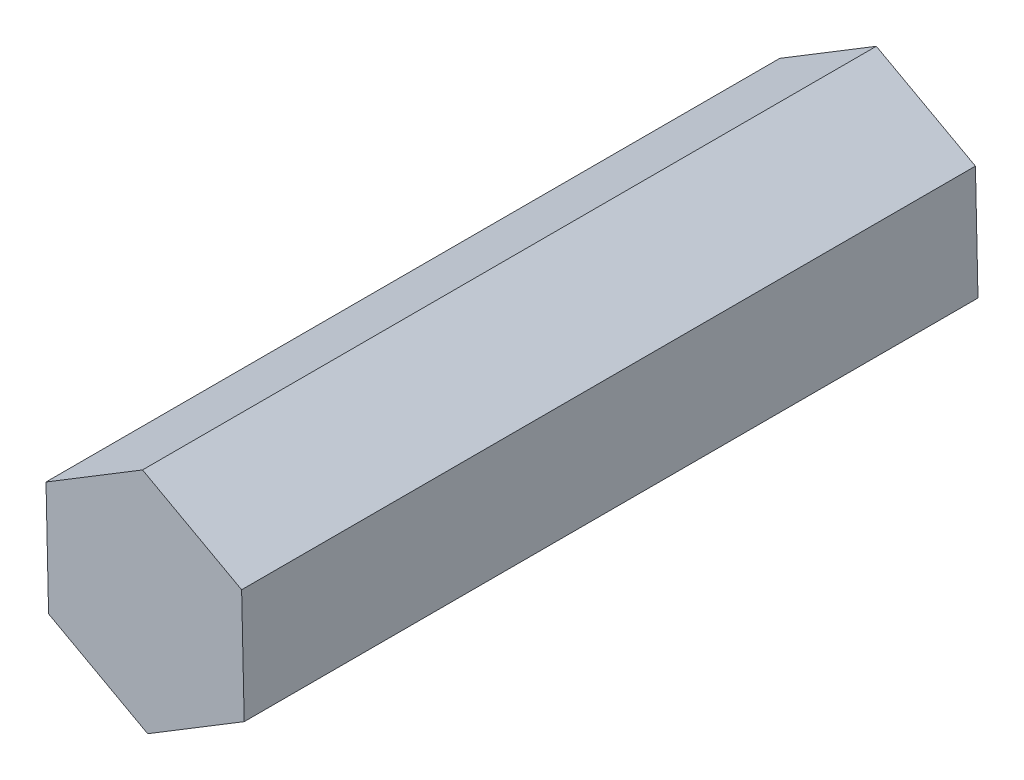
ISO-10303-21;
HEADER;
FILE_DESCRIPTION(('STEP AP214'),'2;1');
FILE_NAME('part.step','',(''),(''),'','','');
FILE_SCHEMA(('AUTOMOTIVE_DESIGN { 1 0 10303 214 1 1 1 1 }'));
ENDSEC;
DATA;
#1=APPLICATION_CONTEXT('core data for automotive mechanical design processes');
#2=APPLICATION_PROTOCOL_DEFINITION('international standard','automotive_design',2000,#1);
#3=PRODUCT_CONTEXT('',#1,'mechanical');
#4=PRODUCT('Part','Part','',(#3));
#5=PRODUCT_RELATED_PRODUCT_CATEGORY('part','',(#4));
#6=PRODUCT_DEFINITION_FORMATION('','',#4);
#7=PRODUCT_DEFINITION_CONTEXT('part definition',#1,'design');
#8=PRODUCT_DEFINITION('design','',#6,#7);
#9=PRODUCT_DEFINITION_SHAPE('','',#8);
#10=(LENGTH_UNIT() NAMED_UNIT(*) SI_UNIT(.MILLI.,.METRE.));
#11=(NAMED_UNIT(*) PLANE_ANGLE_UNIT() SI_UNIT($,.RADIAN.));
#12=(NAMED_UNIT(*) SI_UNIT($,.STERADIAN.) SOLID_ANGLE_UNIT());
#13=UNCERTAINTY_MEASURE_WITH_UNIT(LENGTH_MEASURE(1.E-05),#10,'distance_accuracy_value','');
#14=(GEOMETRIC_REPRESENTATION_CONTEXT(3) GLOBAL_UNCERTAINTY_ASSIGNED_CONTEXT((#13)) GLOBAL_UNIT_ASSIGNED_CONTEXT((#10,
#11,#12)) REPRESENTATION_CONTEXT('',''));
#15=CARTESIAN_POINT('',(0.,0.,0.));
#16=DIRECTION('',(0.,0.,1.));
#17=DIRECTION('',(1.,0.,0.));
#18=AXIS2_PLACEMENT_3D('',#15,#16,#17);
#19=CARTESIAN_POINT('',(-0.167704669362522,7.33043030641499,47.625));
#20=DIRECTION('',(0.519676840163033,-0.854362909891438,0.));
#21=DIRECTION('',(0.854362909891438,0.519676840163033,0.));
#22=AXIS2_PLACEMENT_3D('',#19,#20,#21);
#23=PLANE('',#22);
#24=DIRECTION('',(-0.854362909891438,-0.519676840163033,0.));
#25=VECTOR('',#24,1.);
#26=CARTESIAN_POINT('',(-0.167704669362522,7.33043030641499,0.));
#27=LINE('',#26,#25);
#28=CARTESIAN_POINT('',(-0.167704669362522,7.33043030641499,0.));
#29=VERTEX_POINT('',#28);
#30=CARTESIAN_POINT('',(-6.43219120070799,3.51997864920628,0.));
#31=VERTEX_POINT('',#30);
#32=EDGE_CURVE('E117',#29,#31,#27,.T.);
#33=ORIENTED_EDGE('',*,*,#32,.T.);
#34=DIRECTION('',(0.,0.,-1.));
#35=VECTOR('',#34,1.);
#36=CARTESIAN_POINT('',(-6.43219120070799,3.51997864920628,47.625));
#37=LINE('',#36,#35);
#38=CARTESIAN_POINT('',(-6.43219120070799,3.51997864920628,47.625));
#39=VERTEX_POINT('',#38);
#40=EDGE_CURVE('E11',#39,#31,#37,.T.);
#41=ORIENTED_EDGE('',*,*,#40,.F.);
#42=DIRECTION('',(-0.854362909891438,-0.519676840163033,0.));
#43=VECTOR('',#42,1.);
#44=CARTESIAN_POINT('',(-0.167704669362522,7.33043030641499,47.625));
#45=LINE('',#44,#43);
#46=CARTESIAN_POINT('',(-0.167704669362522,7.33043030641499,47.625));
#47=VERTEX_POINT('',#46);
#48=EDGE_CURVE('E127',#47,#39,#45,.T.);
#49=ORIENTED_EDGE('',*,*,#48,.F.);
#50=DIRECTION('',(0.,0.,-1.));
#51=VECTOR('',#50,1.);
#52=CARTESIAN_POINT('',(-0.167704669362522,7.33043030641499,47.625));
#53=LINE('',#52,#51);
#54=EDGE_CURVE('E113',#47,#29,#53,.T.);
#55=ORIENTED_EDGE('',*,*,#54,.T.);
#56=EDGE_LOOP('',(#33,#41,#49,#55));
#57=FACE_BOUND('',#56,.T.);
#58=ADVANCED_FACE('F33',(#57),#23,.F.);
#59=CARTESIAN_POINT('',(-6.43219120070799,3.51997864920628,47.625));
#60=DIRECTION('',(0.999738404098697,0.0228718903938927,0.));
#61=DIRECTION('',(-0.0228718903938927,0.999738404098697,0.));
#62=AXIS2_PLACEMENT_3D('',#59,#60,#61);
#63=PLANE('',#62);
#64=DIRECTION('',(0.0228718903938927,-0.999738404098697,0.));
#65=VECTOR('',#64,1.);
#66=CARTESIAN_POINT('',(-6.43219120070799,3.51997864920628,0.));
#67=LINE('',#66,#65);
#68=CARTESIAN_POINT('',(-6.26448653134546,-3.81045165720871,0.));
#69=VERTEX_POINT('',#68);
#70=EDGE_CURVE('E120',#31,#69,#67,.T.);
#71=ORIENTED_EDGE('',*,*,#70,.T.);
#72=DIRECTION('',(0.,0.,-1.));
#73=VECTOR('',#72,1.);
#74=CARTESIAN_POINT('',(-6.26448653134546,-3.81045165720871,47.625));
#75=LINE('',#74,#73);
#76=CARTESIAN_POINT('',(-6.26448653134546,-3.81045165720871,47.625));
#77=VERTEX_POINT('',#76);
#78=EDGE_CURVE('E41',#77,#69,#75,.T.);
#79=ORIENTED_EDGE('',*,*,#78,.F.);
#80=DIRECTION('',(0.0228718903938927,-0.999738404098697,0.));
#81=VECTOR('',#80,1.);
#82=CARTESIAN_POINT('',(-6.43219120070799,3.51997864920628,47.625));
#83=LINE('',#82,#81);
#84=EDGE_CURVE('E86',#39,#77,#83,.T.);
#85=ORIENTED_EDGE('',*,*,#84,.F.);
#86=ORIENTED_EDGE('',*,*,#40,.T.);
#87=EDGE_LOOP('',(#71,#79,#85,#86));
#88=FACE_BOUND('',#87,.T.);
#89=ADVANCED_FACE('F151',(#88),#63,.F.);
#90=CARTESIAN_POINT('',(-6.26448653134546,-3.81045165720871,47.625));
#91=DIRECTION('',(0.480061563935664,0.877234800285331,0.));
#92=DIRECTION('',(-0.877234800285331,0.480061563935664,0.));
#93=AXIS2_PLACEMENT_3D('',#90,#91,#92);
#94=PLANE('',#93);
#95=DIRECTION('',(0.877234800285331,-0.480061563935664,0.));
#96=VECTOR('',#95,1.);
#97=CARTESIAN_POINT('',(-6.26448653134546,-3.81045165720871,0.));
#98=LINE('',#97,#96);
#99=CARTESIAN_POINT('',(0.167704669362527,-7.33043030641499,0.));
#100=VERTEX_POINT('',#99);
#101=EDGE_CURVE('E122',#69,#100,#98,.T.);
#102=ORIENTED_EDGE('',*,*,#101,.T.);
#103=DIRECTION('',(0.,0.,-1.));
#104=VECTOR('',#103,1.);
#105=CARTESIAN_POINT('',(0.167704669362527,-7.33043030641499,47.625));
#106=LINE('',#105,#104);
#107=CARTESIAN_POINT('',(0.167704669362527,-7.33043030641499,47.625));
#108=VERTEX_POINT('',#107);
#109=EDGE_CURVE('E108',#108,#100,#106,.T.);
#110=ORIENTED_EDGE('',*,*,#109,.F.);
#111=DIRECTION('',(0.877234800285331,-0.480061563935664,0.));
#112=VECTOR('',#111,1.);
#113=CARTESIAN_POINT('',(-6.26448653134546,-3.81045165720871,47.625));
#114=LINE('',#113,#112);
#115=EDGE_CURVE('E99',#77,#108,#114,.T.);
#116=ORIENTED_EDGE('',*,*,#115,.F.);
#117=ORIENTED_EDGE('',*,*,#78,.T.);
#118=EDGE_LOOP('',(#102,#110,#116,#117));
#119=FACE_BOUND('',#118,.T.);
#120=ADVANCED_FACE('F133',(#119),#94,.F.);
#121=CARTESIAN_POINT('',(0.167704669362527,-7.33043030641499,47.625));
#122=DIRECTION('',(-0.519676840163033,0.854362909891438,0.));
#123=DIRECTION('',(-0.854362909891438,-0.519676840163033,0.));
#124=AXIS2_PLACEMENT_3D('',#121,#122,#123);
#125=PLANE('',#124);
#126=DIRECTION('',(0.854362909891438,0.519676840163033,0.));
#127=VECTOR('',#126,1.);
#128=CARTESIAN_POINT('',(0.167704669362527,-7.33043030641499,0.));
#129=LINE('',#128,#127);
#130=CARTESIAN_POINT('',(6.43219120070799,-3.51997864920628,0.));
#131=VERTEX_POINT('',#130);
#132=EDGE_CURVE('E107',#100,#131,#129,.T.);
#133=ORIENTED_EDGE('',*,*,#132,.T.);
#134=DIRECTION('',(0.,0.,-1.));
#135=VECTOR('',#134,1.);
#136=CARTESIAN_POINT('',(6.43219120070799,-3.51997864920628,47.625));
#137=LINE('',#136,#135);
#138=CARTESIAN_POINT('',(6.43219120070799,-3.51997864920628,47.625));
#139=VERTEX_POINT('',#138);
#140=EDGE_CURVE('E104',#139,#131,#137,.T.);
#141=ORIENTED_EDGE('',*,*,#140,.F.);
#142=DIRECTION('',(0.854362909891438,0.519676840163033,0.));
#143=VECTOR('',#142,1.);
#144=CARTESIAN_POINT('',(0.167704669362527,-7.33043030641499,47.625));
#145=LINE('',#144,#143);
#146=EDGE_CURVE('E93',#108,#139,#145,.T.);
#147=ORIENTED_EDGE('',*,*,#146,.F.);
#148=ORIENTED_EDGE('',*,*,#109,.T.);
#149=EDGE_LOOP('',(#133,#141,#147,#148));
#150=FACE_BOUND('',#149,.T.);
#151=ADVANCED_FACE('F105',(#150),#125,.F.);
#152=CARTESIAN_POINT('',(6.43219120070799,-3.51997864920628,47.625));
#153=DIRECTION('',(-0.999738404098697,-0.0228718903938919,0.));
#154=DIRECTION('',(0.0228718903938919,-0.999738404098697,0.));
#155=AXIS2_PLACEMENT_3D('',#152,#153,#154);
#156=PLANE('',#155);
#157=DIRECTION('',(-0.0228718903938919,0.999738404098697,0.));
#158=VECTOR('',#157,1.);
#159=CARTESIAN_POINT('',(6.43219120070799,-3.51997864920628,0.));
#160=LINE('',#159,#158);
#161=CARTESIAN_POINT('',(6.26448653134546,3.81045165720871,0.));
#162=VERTEX_POINT('',#161);
#163=EDGE_CURVE('E72',#131,#162,#160,.T.);
#164=ORIENTED_EDGE('',*,*,#163,.T.);
#165=DIRECTION('',(0.,0.,-1.));
#166=VECTOR('',#165,1.);
#167=CARTESIAN_POINT('',(6.26448653134546,3.81045165720871,47.625));
#168=LINE('',#167,#166);
#169=CARTESIAN_POINT('',(6.26448653134546,3.81045165720871,47.625));
#170=VERTEX_POINT('',#169);
#171=EDGE_CURVE('E109',#170,#162,#168,.T.);
#172=ORIENTED_EDGE('',*,*,#171,.F.);
#173=DIRECTION('',(-0.0228718903938919,0.999738404098697,0.));
#174=VECTOR('',#173,1.);
#175=CARTESIAN_POINT('',(6.43219120070799,-3.51997864920628,47.625));
#176=LINE('',#175,#174);
#177=EDGE_CURVE('E97',#139,#170,#176,.T.);
#178=ORIENTED_EDGE('',*,*,#177,.F.);
#179=ORIENTED_EDGE('',*,*,#140,.T.);
#180=EDGE_LOOP('',(#164,#172,#178,#179));
#181=FACE_BOUND('',#180,.T.);
#182=ADVANCED_FACE('F111',(#181),#156,.F.);
#183=CARTESIAN_POINT('',(6.26448653134546,3.81045165720871,47.625));
#184=DIRECTION('',(-0.480061563935665,-0.87723480028533,0.));
#185=DIRECTION('',(0.87723480028533,-0.480061563935665,0.));
#186=AXIS2_PLACEMENT_3D('',#183,#184,#185);
#187=PLANE('',#186);
#188=DIRECTION('',(-0.877234800285331,0.480061563935665,0.));
#189=VECTOR('',#188,1.);
#190=CARTESIAN_POINT('',(6.26448653134546,3.81045165720871,0.));
#191=LINE('',#190,#189);
#192=EDGE_CURVE('E78',#162,#29,#191,.T.);
#193=ORIENTED_EDGE('',*,*,#192,.T.);
#194=ORIENTED_EDGE('',*,*,#54,.F.);
#195=DIRECTION('',(-0.877234800285331,0.480061563935665,0.));
#196=VECTOR('',#195,1.);
#197=CARTESIAN_POINT('',(6.26448653134546,3.81045165720871,47.625));
#198=LINE('',#197,#196);
#199=EDGE_CURVE('E49',#170,#47,#198,.T.);
#200=ORIENTED_EDGE('',*,*,#199,.F.);
#201=ORIENTED_EDGE('',*,*,#171,.T.);
#202=EDGE_LOOP('',(#193,#194,#200,#201));
#203=FACE_BOUND('',#202,.T.);
#204=ADVANCED_FACE('F140',(#203),#187,.F.);
#205=CARTESIAN_POINT('',(0.,0.,47.625));
#206=DIRECTION('',(0.,0.,1.));
#207=DIRECTION('',(1.,0.,0.));
#208=AXIS2_PLACEMENT_3D('',#205,#206,#207);
#209=PLANE('',#208);
#210=ORIENTED_EDGE('',*,*,#48,.T.);
#211=ORIENTED_EDGE('',*,*,#84,.T.);
#212=ORIENTED_EDGE('',*,*,#115,.T.);
#213=ORIENTED_EDGE('',*,*,#146,.T.);
#214=ORIENTED_EDGE('',*,*,#177,.T.);
#215=ORIENTED_EDGE('',*,*,#199,.T.);
#216=EDGE_LOOP('',(#210,#211,#212,#213,#214,#215));
#217=FACE_BOUND('',#216,.T.);
#218=ADVANCED_FACE('F95',(#217),#209,.T.);
#219=CARTESIAN_POINT('',(0.,0.,0.));
#220=DIRECTION('',(0.,0.,1.));
#221=DIRECTION('',(1.,0.,0.));
#222=AXIS2_PLACEMENT_3D('',#219,#220,#221);
#223=PLANE('',#222);
#224=ORIENTED_EDGE('',*,*,#32,.F.);
#225=ORIENTED_EDGE('',*,*,#192,.F.);
#226=ORIENTED_EDGE('',*,*,#163,.F.);
#227=ORIENTED_EDGE('',*,*,#132,.F.);
#228=ORIENTED_EDGE('',*,*,#101,.F.);
#229=ORIENTED_EDGE('',*,*,#70,.F.);
#230=EDGE_LOOP('',(#224,#225,#226,#227,#228,#229));
#231=FACE_BOUND('',#230,.T.);
#232=ADVANCED_FACE('F136',(#231),#223,.F.);
#233=CLOSED_SHELL('',(#58,#89,#120,#151,#182,#204,#218,#232));
#234=MANIFOLD_SOLID_BREP('B2',#233);
#235=ADVANCED_BREP_SHAPE_REPRESENTATION('',(#18,#234),#14);
#236=SHAPE_DEFINITION_REPRESENTATION(#9,#235);
ENDSEC;
END-ISO-10303-21;
